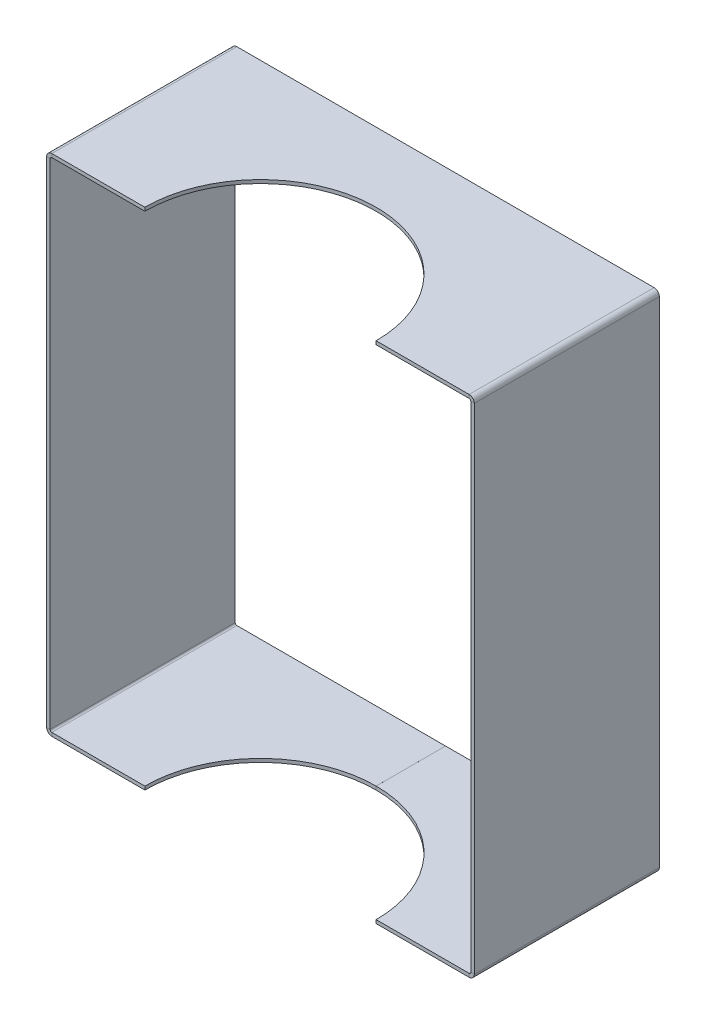
ISO-10303-21;
HEADER;
FILE_DESCRIPTION(('STEP AP214'),'2;1');
FILE_NAME('part.step','',(''),(''),'','','');
FILE_SCHEMA(('AUTOMOTIVE_DESIGN { 1 0 10303 214 1 1 1 1 }'));
ENDSEC;
DATA;
#1=APPLICATION_CONTEXT('core data for automotive mechanical design processes');
#2=APPLICATION_PROTOCOL_DEFINITION('international standard','automotive_design',2000,#1);
#3=PRODUCT_CONTEXT('',#1,'mechanical');
#4=PRODUCT('Part','Part','',(#3));
#5=PRODUCT_RELATED_PRODUCT_CATEGORY('part','',(#4));
#6=PRODUCT_DEFINITION_FORMATION('','',#4);
#7=PRODUCT_DEFINITION_CONTEXT('part definition',#1,'design');
#8=PRODUCT_DEFINITION('design','',#6,#7);
#9=PRODUCT_DEFINITION_SHAPE('','',#8);
#10=(LENGTH_UNIT() NAMED_UNIT(*) SI_UNIT(.MILLI.,.METRE.));
#11=(NAMED_UNIT(*) PLANE_ANGLE_UNIT() SI_UNIT($,.RADIAN.));
#12=(NAMED_UNIT(*) SI_UNIT($,.STERADIAN.) SOLID_ANGLE_UNIT());
#13=UNCERTAINTY_MEASURE_WITH_UNIT(LENGTH_MEASURE(1.E-05),#10,'distance_accuracy_value','');
#14=(GEOMETRIC_REPRESENTATION_CONTEXT(3) GLOBAL_UNCERTAINTY_ASSIGNED_CONTEXT((#13)) GLOBAL_UNIT_ASSIGNED_CONTEXT((#10,
#11,#12)) REPRESENTATION_CONTEXT('',''));
#15=CARTESIAN_POINT('',(0.,0.,0.));
#16=DIRECTION('',(0.,0.,1.));
#17=DIRECTION('',(1.,0.,0.));
#18=AXIS2_PLACEMENT_3D('',#15,#16,#17);
#19=CARTESIAN_POINT('',(-90.2234000000008,1.5,173.673110700389));
#20=DIRECTION('',(0.,0.,-1.));
#21=DIRECTION('',(-1.,0.,0.));
#22=AXIS2_PLACEMENT_3D('',#19,#20,#21);
#23=PLANE('',#22);
#24=DIRECTION('',(1.,0.,0.));
#25=VECTOR('',#24,1.);
#26=CARTESIAN_POINT('',(-90.2234000000008,0.,173.673110700389));
#27=LINE('',#26,#25);
#28=CARTESIAN_POINT('',(-90.2234000000008,0.,173.673110700389));
#29=VERTEX_POINT('',#28);
#30=CARTESIAN_POINT('',(-50.0234000000008,0.,173.673110700389));
#31=VERTEX_POINT('',#30);
#32=EDGE_CURVE('E151',#29,#31,#27,.T.);
#33=ORIENTED_EDGE('',*,*,#32,.T.);
#34=DIRECTION('',(0.,-1.,0.));
#35=VECTOR('',#34,1.);
#36=CARTESIAN_POINT('',(-50.0234000000008,1.5,173.673110700389));
#37=LINE('',#36,#35);
#38=CARTESIAN_POINT('',(-50.0234000000008,1.5,173.673110700389));
#39=VERTEX_POINT('',#38);
#40=EDGE_CURVE('E131',#39,#31,#37,.T.);
#41=ORIENTED_EDGE('',*,*,#40,.F.);
#42=DIRECTION('',(1.,0.,0.));
#43=VECTOR('',#42,1.);
#44=CARTESIAN_POINT('',(-90.2234000000008,1.5,173.673110700389));
#45=LINE('',#44,#43);
#46=CARTESIAN_POINT('',(-90.2234000000008,1.5,173.673110700389));
#47=VERTEX_POINT('',#46);
#48=EDGE_CURVE('E182',#47,#39,#45,.T.);
#49=ORIENTED_EDGE('',*,*,#48,.F.);
#50=DIRECTION('',(0.,-1.,0.));
#51=VECTOR('',#50,1.);
#52=CARTESIAN_POINT('',(-90.2234000000008,1.5,173.673110700389));
#53=LINE('',#52,#51);
#54=EDGE_CURVE('E13',#47,#29,#53,.T.);
#55=ORIENTED_EDGE('',*,*,#54,.T.);
#56=EDGE_LOOP('',(#33,#41,#49,#55));
#57=FACE_BOUND('',#56,.T.);
#58=ADVANCED_FACE('F123',(#57),#23,.F.);
#59=CARTESIAN_POINT('',(-0.0234000000007839,1.5,173.673110700389));
#60=DIRECTION('',(0.,-1.,0.));
#61=DIRECTION('',(0.,0.,-1.));
#62=AXIS2_PLACEMENT_3D('',#59,#60,#61);
#63=CYLINDRICAL_SURFACE('',#62,50.);
#64=CARTESIAN_POINT('',(-0.0234000000007839,0.,173.673110700389));
#65=DIRECTION('',(0.,-1.,0.));
#66=DIRECTION('',(0.,0.,-1.));
#67=AXIS2_PLACEMENT_3D('',#64,#65,#66);
#68=CIRCLE('',#67,50.);
#69=CARTESIAN_POINT('',(49.9765999999992,0.,173.673110700389));
#70=VERTEX_POINT('',#69);
#71=EDGE_CURVE('E211',#31,#70,#68,.T.);
#72=ORIENTED_EDGE('',*,*,#71,.T.);
#73=DIRECTION('',(0.,-1.,0.));
#74=VECTOR('',#73,1.);
#75=CARTESIAN_POINT('',(49.9765999999992,1.5,173.673110700389));
#76=LINE('',#75,#74);
#77=CARTESIAN_POINT('',(49.9765999999992,1.5,173.673110700389));
#78=VERTEX_POINT('',#77);
#79=EDGE_CURVE('E194',#78,#70,#76,.T.);
#80=ORIENTED_EDGE('',*,*,#79,.F.);
#81=CARTESIAN_POINT('',(-0.0234000000007839,1.5,173.673110700389));
#82=DIRECTION('',(0.,-1.,0.));
#83=DIRECTION('',(0.,0.,-1.));
#84=AXIS2_PLACEMENT_3D('',#81,#82,#83);
#85=CIRCLE('',#84,50.);
#86=EDGE_CURVE('E186',#39,#78,#85,.T.);
#87=ORIENTED_EDGE('',*,*,#86,.F.);
#88=ORIENTED_EDGE('',*,*,#40,.T.);
#89=EDGE_LOOP('',(#72,#80,#87,#88));
#90=FACE_BOUND('',#89,.T.);
#91=ADVANCED_FACE('F195',(#90),#63,.F.);
#92=CARTESIAN_POINT('',(49.9765999999992,1.5,173.673110700389));
#93=DIRECTION('',(0.,0.,-1.));
#94=DIRECTION('',(-1.,0.,0.));
#95=AXIS2_PLACEMENT_3D('',#92,#93,#94);
#96=PLANE('',#95);
#97=DIRECTION('',(1.,0.,0.));
#98=VECTOR('',#97,1.);
#99=CARTESIAN_POINT('',(49.9765999999992,0.,173.673110700389));
#100=LINE('',#99,#98);
#101=CARTESIAN_POINT('',(90.1765999999992,0.,173.673110700389));
#102=VERTEX_POINT('',#101);
#103=EDGE_CURVE('E213',#70,#102,#100,.T.);
#104=ORIENTED_EDGE('',*,*,#103,.T.);
#105=DIRECTION('',(0.,-1.,0.));
#106=VECTOR('',#105,1.);
#107=CARTESIAN_POINT('',(90.1765999999992,1.5,173.673110700389));
#108=LINE('',#107,#106);
#109=CARTESIAN_POINT('',(90.1765999999993,1.5,173.673110700389));
#110=VERTEX_POINT('',#109);
#111=EDGE_CURVE('E226',#110,#102,#108,.T.);
#112=ORIENTED_EDGE('',*,*,#111,.F.);
#113=DIRECTION('',(1.,0.,0.));
#114=VECTOR('',#113,1.);
#115=CARTESIAN_POINT('',(49.9765999999992,1.5,173.673110700389));
#116=LINE('',#115,#114);
#117=EDGE_CURVE('E198',#78,#110,#116,.T.);
#118=ORIENTED_EDGE('',*,*,#117,.F.);
#119=ORIENTED_EDGE('',*,*,#79,.T.);
#120=EDGE_LOOP('',(#104,#112,#118,#119));
#121=FACE_BOUND('',#120,.T.);
#122=ADVANCED_FACE('F230',(#121),#96,.F.);
#123=CARTESIAN_POINT('',(-90.2234000000008,1.5,93.673110700389));
#124=DIRECTION('',(0.,0.,1.));
#125=DIRECTION('',(1.,0.,0.));
#126=AXIS2_PLACEMENT_3D('',#123,#124,#125);
#127=PLANE('',#126);
#128=DIRECTION('',(-1.,0.,0.));
#129=VECTOR('',#128,1.);
#130=CARTESIAN_POINT('',(-90.2234000000008,0.,93.673110700389));
#131=LINE('',#130,#129);
#132=CARTESIAN_POINT('',(90.1765999999992,0.,93.673110700389));
#133=VERTEX_POINT('',#132);
#134=CARTESIAN_POINT('',(-90.2234000000008,0.,93.673110700389));
#135=VERTEX_POINT('',#134);
#136=EDGE_CURVE('E218',#133,#135,#131,.T.);
#137=ORIENTED_EDGE('',*,*,#136,.T.);
#138=DIRECTION('',(0.,-1.,0.));
#139=VECTOR('',#138,1.);
#140=CARTESIAN_POINT('',(-90.2234000000008,1.5,93.673110700389));
#141=LINE('',#140,#139);
#142=CARTESIAN_POINT('',(-90.2234000000008,1.49999999999998,93.673110700389));
#143=VERTEX_POINT('',#142);
#144=EDGE_CURVE('E206',#143,#135,#141,.T.);
#145=ORIENTED_EDGE('',*,*,#144,.F.);
#146=DIRECTION('',(-1.,0.,0.));
#147=VECTOR('',#146,1.);
#148=CARTESIAN_POINT('',(-90.2234000000008,1.5,93.673110700389));
#149=LINE('',#148,#147);
#150=CARTESIAN_POINT('',(90.1765999999992,1.5,93.673110700389));
#151=VERTEX_POINT('',#150);
#152=EDGE_CURVE('E204',#151,#143,#149,.T.);
#153=ORIENTED_EDGE('',*,*,#152,.F.);
#154=DIRECTION('',(0.,-1.,0.));
#155=VECTOR('',#154,1.);
#156=CARTESIAN_POINT('',(90.1765999999992,1.5,93.673110700389));
#157=LINE('',#156,#155);
#158=EDGE_CURVE('E223',#151,#133,#157,.T.);
#159=ORIENTED_EDGE('',*,*,#158,.T.);
#160=EDGE_LOOP('',(#137,#145,#153,#159));
#161=FACE_BOUND('',#160,.T.);
#162=ADVANCED_FACE('F254',(#161),#127,.F.);
#163=CARTESIAN_POINT('',(-0.0234000000007839,1.5,173.673110700389));
#164=DIRECTION('',(0.,-1.,0.));
#165=DIRECTION('',(0.,0.,-1.));
#166=AXIS2_PLACEMENT_3D('',#163,#164,#165);
#167=PLANE('',#166);
#168=DIRECTION('',(0.,0.,1.));
#169=VECTOR('',#168,1.);
#170=CARTESIAN_POINT('',(-90.2234000000008,1.5,93.673110700389));
#171=LINE('',#170,#169);
#172=EDGE_CURVE('E190',#143,#47,#171,.T.);
#173=ORIENTED_EDGE('',*,*,#172,.T.);
#174=ORIENTED_EDGE('',*,*,#48,.T.);
#175=ORIENTED_EDGE('',*,*,#86,.T.);
#176=ORIENTED_EDGE('',*,*,#117,.T.);
#177=DIRECTION('',(0.,0.,-1.));
#178=VECTOR('',#177,1.);
#179=CARTESIAN_POINT('',(90.1765999999992,1.5,93.673110700389));
#180=LINE('',#179,#178);
#181=EDGE_CURVE('E159',#110,#151,#180,.T.);
#182=ORIENTED_EDGE('',*,*,#181,.T.);
#183=ORIENTED_EDGE('',*,*,#152,.T.);
#184=EDGE_LOOP('',(#173,#174,#175,#176,#182,#183));
#185=FACE_BOUND('',#184,.T.);
#186=ADVANCED_FACE('F183',(#185),#167,.F.);
#187=CARTESIAN_POINT('',(-0.0234000000007839,0.,173.673110700389));
#188=DIRECTION('',(0.,-1.,0.));
#189=DIRECTION('',(0.,0.,-1.));
#190=AXIS2_PLACEMENT_3D('',#187,#188,#189);
#191=PLANE('',#190);
#192=DIRECTION('',(0.,0.,1.));
#193=VECTOR('',#192,1.);
#194=CARTESIAN_POINT('',(-90.2234000000008,0.,93.673110700389));
#195=LINE('',#194,#193);
#196=EDGE_CURVE('E207',#135,#29,#195,.T.);
#197=ORIENTED_EDGE('',*,*,#196,.F.);
#198=ORIENTED_EDGE('',*,*,#136,.F.);
#199=DIRECTION('',(0.,0.,-1.));
#200=VECTOR('',#199,1.);
#201=CARTESIAN_POINT('',(90.1765999999992,0.,93.673110700389));
#202=LINE('',#201,#200);
#203=EDGE_CURVE('E216',#102,#133,#202,.T.);
#204=ORIENTED_EDGE('',*,*,#203,.F.);
#205=ORIENTED_EDGE('',*,*,#103,.F.);
#206=ORIENTED_EDGE('',*,*,#71,.F.);
#207=ORIENTED_EDGE('',*,*,#32,.F.);
#208=EDGE_LOOP('',(#197,#198,#204,#205,#206,#207));
#209=FACE_BOUND('',#208,.T.);
#210=ADVANCED_FACE('F235',(#209),#191,.T.);
#211=CARTESIAN_POINT('',(90.1765999999992,-0.736600000000006,93.673110700389));
#212=DIRECTION('',(0.,0.,-1.));
#213=DIRECTION('',(-1.,0.,0.));
#214=AXIS2_PLACEMENT_3D('',#211,#212,#213);
#215=PLANE('',#214);
#216=DIRECTION('',(1.,0.,0.));
#217=VECTOR('',#216,1.);
#218=CARTESIAN_POINT('',(92.4131999999992,-0.736600000000004,93.673110700389));
#219=LINE('',#218,#217);
#220=CARTESIAN_POINT('',(90.9131999999992,-0.736600000000004,93.673110700389));
#221=VERTEX_POINT('',#220);
#222=CARTESIAN_POINT('',(92.4131999999992,-0.736599999999999,93.673110700389));
#223=VERTEX_POINT('',#222);
#224=EDGE_CURVE('E249',#221,#223,#219,.T.);
#225=ORIENTED_EDGE('',*,*,#224,.F.);
#226=CARTESIAN_POINT('',(90.1765999999992,-0.736600000000006,93.673110700389));
#227=DIRECTION('',(0.,0.,1.));
#228=DIRECTION('',(1.,0.,0.));
#229=AXIS2_PLACEMENT_3D('',#226,#227,#228);
#230=CIRCLE('',#229,0.736600000000004);
#231=EDGE_CURVE('E242',#133,#221,#230,.F.);
#232=ORIENTED_EDGE('',*,*,#231,.F.);
#233=ORIENTED_EDGE('',*,*,#158,.F.);
#234=CARTESIAN_POINT('',(90.1765999999992,-0.736600000000006,93.673110700389));
#235=DIRECTION('',(0.,0.,1.));
#236=DIRECTION('',(1.,0.,0.));
#237=AXIS2_PLACEMENT_3D('',#234,#235,#236);
#238=CIRCLE('',#237,2.2366);
#239=EDGE_CURVE('E139',#151,#223,#238,.F.);
#240=ORIENTED_EDGE('',*,*,#239,.T.);
#241=EDGE_LOOP('',(#225,#232,#233,#240));
#242=FACE_BOUND('',#241,.T.);
#243=ADVANCED_FACE('F247',(#242),#215,.T.);
#244=CARTESIAN_POINT('',(90.1765999999992,-0.736600000000006,173.673110700389));
#245=DIRECTION('',(0.,0.,-1.));
#246=DIRECTION('',(-1.,0.,0.));
#247=AXIS2_PLACEMENT_3D('',#244,#245,#246);
#248=PLANE('',#247);
#249=CARTESIAN_POINT('',(90.1765999999992,-0.736600000000006,173.673110700389));
#250=DIRECTION('',(0.,0.,1.));
#251=DIRECTION('',(1.,0.,0.));
#252=AXIS2_PLACEMENT_3D('',#249,#250,#251);
#253=CIRCLE('',#252,0.736600000000004);
#254=CARTESIAN_POINT('',(90.9131999999992,-0.736600000000004,173.673110700389));
#255=VERTEX_POINT('',#254);
#256=EDGE_CURVE('E245',#255,#102,#253,.T.);
#257=ORIENTED_EDGE('',*,*,#256,.F.);
#258=DIRECTION('',(1.,0.,0.));
#259=VECTOR('',#258,1.);
#260=CARTESIAN_POINT('',(90.9131999999993,-0.736600000000004,173.673110700389));
#261=LINE('',#260,#259);
#262=CARTESIAN_POINT('',(92.4131999999992,-0.736599999999999,173.673110700389));
#263=VERTEX_POINT('',#262);
#264=EDGE_CURVE('E377',#255,#263,#261,.T.);
#265=ORIENTED_EDGE('',*,*,#264,.T.);
#266=CARTESIAN_POINT('',(90.1765999999992,-0.736600000000006,173.673110700389));
#267=DIRECTION('',(0.,0.,1.));
#268=DIRECTION('',(1.,0.,0.));
#269=AXIS2_PLACEMENT_3D('',#266,#267,#268);
#270=CIRCLE('',#269,2.2366);
#271=EDGE_CURVE('E250',#263,#110,#270,.T.);
#272=ORIENTED_EDGE('',*,*,#271,.T.);
#273=ORIENTED_EDGE('',*,*,#111,.T.);
#274=EDGE_LOOP('',(#257,#265,#272,#273));
#275=FACE_BOUND('',#274,.T.);
#276=ADVANCED_FACE('F385',(#275),#248,.F.);
#277=CARTESIAN_POINT('',(90.1765999999992,-0.736600000000006,173.673110700389));
#278=DIRECTION('',(0.,0.,1.));
#279=DIRECTION('',(1.,0.,0.));
#280=AXIS2_PLACEMENT_3D('',#277,#278,#279);
#281=CYLINDRICAL_SURFACE('',#280,2.2366);
#282=ORIENTED_EDGE('',*,*,#181,.F.);
#283=ORIENTED_EDGE('',*,*,#271,.F.);
#284=DIRECTION('',(0.,0.,1.));
#285=VECTOR('',#284,1.);
#286=CARTESIAN_POINT('',(92.4131999999992,-0.736599999999999,173.673110700389));
#287=LINE('',#286,#285);
#288=EDGE_CURVE('E329',#223,#263,#287,.T.);
#289=ORIENTED_EDGE('',*,*,#288,.F.);
#290=ORIENTED_EDGE('',*,*,#239,.F.);
#291=EDGE_LOOP('',(#282,#283,#289,#290));
#292=FACE_BOUND('',#291,.T.);
#293=ADVANCED_FACE('F387',(#292),#281,.T.);
#294=CARTESIAN_POINT('',(90.1765999999992,-0.736600000000006,173.673110700389));
#295=DIRECTION('',(0.,0.,1.));
#296=DIRECTION('',(1.,0.,0.));
#297=AXIS2_PLACEMENT_3D('',#294,#295,#296);
#298=CYLINDRICAL_SURFACE('',#297,0.736600000000004);
#299=ORIENTED_EDGE('',*,*,#203,.T.);
#300=ORIENTED_EDGE('',*,*,#231,.T.);
#301=DIRECTION('',(0.,0.,-1.));
#302=VECTOR('',#301,1.);
#303=CARTESIAN_POINT('',(90.9131999999992,-0.736600000000004,93.673110700389));
#304=LINE('',#303,#302);
#305=EDGE_CURVE('E327',#221,#255,#304,.F.);
#306=ORIENTED_EDGE('',*,*,#305,.T.);
#307=ORIENTED_EDGE('',*,*,#256,.T.);
#308=EDGE_LOOP('',(#299,#300,#306,#307));
#309=FACE_BOUND('',#308,.T.);
#310=ADVANCED_FACE('F241',(#309),#298,.F.);
#311=CARTESIAN_POINT('',(92.4131999999992,0.,173.673110700389));
#312=DIRECTION('',(0.,0.,1.));
#313=DIRECTION('',(1.,0.,0.));
#314=AXIS2_PLACEMENT_3D('',#311,#312,#313);
#315=PLANE('',#314);
#316=DIRECTION('',(0.,1.,0.));
#317=VECTOR('',#316,1.);
#318=CARTESIAN_POINT('',(92.4131999999992,0.,173.673110700389));
#319=LINE('',#318,#317);
#320=CARTESIAN_POINT('',(92.4132,-214.5,173.673110700389));
#321=VERTEX_POINT('',#320);
#322=EDGE_CURVE('E342',#321,#263,#319,.T.);
#323=ORIENTED_EDGE('',*,*,#322,.T.);
#324=ORIENTED_EDGE('',*,*,#264,.F.);
#325=DIRECTION('',(0.,-1.,0.));
#326=VECTOR('',#325,1.);
#327=CARTESIAN_POINT('',(90.9131999999992,0.,173.673110700389));
#328=LINE('',#327,#326);
#329=CARTESIAN_POINT('',(90.9132,-214.5,173.673110700389));
#330=VERTEX_POINT('',#329);
#331=EDGE_CURVE('E352',#330,#255,#328,.F.);
#332=ORIENTED_EDGE('',*,*,#331,.F.);
#333=DIRECTION('',(-1.,0.,0.));
#334=VECTOR('',#333,1.);
#335=CARTESIAN_POINT('',(92.4132,-214.5,173.673110700389));
#336=LINE('',#335,#334);
#337=EDGE_CURVE('E341',#321,#330,#336,.T.);
#338=ORIENTED_EDGE('',*,*,#337,.F.);
#339=EDGE_LOOP('',(#323,#324,#332,#338));
#340=FACE_BOUND('',#339,.T.);
#341=ADVANCED_FACE('F660',(#340),#315,.T.);
#342=CARTESIAN_POINT('',(92.4132,-214.5,93.673110700389));
#343=DIRECTION('',(0.,0.,-1.));
#344=DIRECTION('',(-1.,0.,0.));
#345=AXIS2_PLACEMENT_3D('',#342,#343,#344);
#346=PLANE('',#345);
#347=DIRECTION('',(0.,1.,0.));
#348=VECTOR('',#347,1.);
#349=CARTESIAN_POINT('',(90.9131999999992,0.,93.673110700389));
#350=LINE('',#349,#348);
#351=CARTESIAN_POINT('',(90.9132,-214.5,93.673110700389));
#352=VERTEX_POINT('',#351);
#353=EDGE_CURVE('E320',#221,#352,#350,.F.);
#354=ORIENTED_EDGE('',*,*,#353,.F.);
#355=ORIENTED_EDGE('',*,*,#224,.T.);
#356=DIRECTION('',(0.,-1.,0.));
#357=VECTOR('',#356,1.);
#358=CARTESIAN_POINT('',(92.4132,-214.5,93.673110700389));
#359=LINE('',#358,#357);
#360=CARTESIAN_POINT('',(92.4132,-214.5,93.673110700389));
#361=VERTEX_POINT('',#360);
#362=EDGE_CURVE('E335',#223,#361,#359,.T.);
#363=ORIENTED_EDGE('',*,*,#362,.T.);
#364=DIRECTION('',(-1.,0.,0.));
#365=VECTOR('',#364,1.);
#366=CARTESIAN_POINT('',(92.4132,-214.5,93.673110700389));
#367=LINE('',#366,#365);
#368=EDGE_CURVE('E332',#361,#352,#367,.T.);
#369=ORIENTED_EDGE('',*,*,#368,.T.);
#370=EDGE_LOOP('',(#354,#355,#363,#369));
#371=FACE_BOUND('',#370,.T.);
#372=ADVANCED_FACE('F333',(#371),#346,.T.);
#373=CARTESIAN_POINT('',(92.4131999999992,0.,173.673110700389));
#374=DIRECTION('',(1.,0.,0.));
#375=DIRECTION('',(0.,1.,0.));
#376=AXIS2_PLACEMENT_3D('',#373,#374,#375);
#377=PLANE('',#376);
#378=ORIENTED_EDGE('',*,*,#362,.F.);
#379=ORIENTED_EDGE('',*,*,#288,.T.);
#380=ORIENTED_EDGE('',*,*,#322,.F.);
#381=DIRECTION('',(0.,0.,1.));
#382=VECTOR('',#381,1.);
#383=CARTESIAN_POINT('',(92.4132,-214.5,173.673110700389));
#384=LINE('',#383,#382);
#385=EDGE_CURVE('E370',#361,#321,#384,.T.);
#386=ORIENTED_EDGE('',*,*,#385,.F.);
#387=EDGE_LOOP('',(#378,#379,#380,#386));
#388=FACE_BOUND('',#387,.T.);
#389=ADVANCED_FACE('F389',(#388),#377,.T.);
#390=CARTESIAN_POINT('',(90.9131999999992,0.,173.673110700389));
#391=DIRECTION('',(1.,0.,0.));
#392=DIRECTION('',(0.,1.,0.));
#393=AXIS2_PLACEMENT_3D('',#390,#391,#392);
#394=PLANE('',#393);
#395=ORIENTED_EDGE('',*,*,#305,.F.);
#396=ORIENTED_EDGE('',*,*,#353,.T.);
#397=DIRECTION('',(0.,0.,-1.));
#398=VECTOR('',#397,1.);
#399=CARTESIAN_POINT('',(90.9132,-214.5,173.673110700389));
#400=LINE('',#399,#398);
#401=EDGE_CURVE('E325',#352,#330,#400,.F.);
#402=ORIENTED_EDGE('',*,*,#401,.T.);
#403=ORIENTED_EDGE('',*,*,#331,.T.);
#404=EDGE_LOOP('',(#395,#396,#402,#403));
#405=FACE_BOUND('',#404,.T.);
#406=ADVANCED_FACE('F322',(#405),#394,.F.);
#407=CARTESIAN_POINT('',(90.1766,-214.5,93.673110700389));
#408=DIRECTION('',(0.,0.,-1.));
#409=DIRECTION('',(-1.,0.,0.));
#410=AXIS2_PLACEMENT_3D('',#407,#408,#409);
#411=PLANE('',#410);
#412=DIRECTION('',(0.,-1.,0.));
#413=VECTOR('',#412,1.);
#414=CARTESIAN_POINT('',(90.1766,-216.7366,93.673110700389));
#415=LINE('',#414,#413);
#416=CARTESIAN_POINT('',(90.1766,-215.2366,93.673110700389));
#417=VERTEX_POINT('',#416);
#418=CARTESIAN_POINT('',(90.1766,-216.7366,93.673110700389));
#419=VERTEX_POINT('',#418);
#420=EDGE_CURVE('E356',#417,#419,#415,.T.);
#421=ORIENTED_EDGE('',*,*,#420,.F.);
#422=CARTESIAN_POINT('',(90.1766,-214.5,93.673110700389));
#423=DIRECTION('',(0.,0.,1.));
#424=DIRECTION('',(1.,0.,0.));
#425=AXIS2_PLACEMENT_3D('',#422,#423,#424);
#426=CIRCLE('',#425,0.736600000000004);
#427=EDGE_CURVE('E348',#352,#417,#426,.F.);
#428=ORIENTED_EDGE('',*,*,#427,.F.);
#429=ORIENTED_EDGE('',*,*,#368,.F.);
#430=CARTESIAN_POINT('',(90.1766,-214.5,93.673110700389));
#431=DIRECTION('',(0.,0.,1.));
#432=DIRECTION('',(1.,0.,0.));
#433=AXIS2_PLACEMENT_3D('',#430,#431,#432);
#434=CIRCLE('',#433,2.2366);
#435=EDGE_CURVE('E360',#361,#419,#434,.F.);
#436=ORIENTED_EDGE('',*,*,#435,.T.);
#437=EDGE_LOOP('',(#421,#428,#429,#436));
#438=FACE_BOUND('',#437,.T.);
#439=ADVANCED_FACE('F354',(#438),#411,.T.);
#440=CARTESIAN_POINT('',(90.1766,-214.5,173.673110700389));
#441=DIRECTION('',(0.,0.,-1.));
#442=DIRECTION('',(-1.,0.,0.));
#443=AXIS2_PLACEMENT_3D('',#440,#441,#442);
#444=PLANE('',#443);
#445=CARTESIAN_POINT('',(90.1766,-214.5,173.673110700389));
#446=DIRECTION('',(0.,0.,1.));
#447=DIRECTION('',(1.,0.,0.));
#448=AXIS2_PLACEMENT_3D('',#445,#446,#447);
#449=CIRCLE('',#448,0.736600000000004);
#450=CARTESIAN_POINT('',(90.1766,-215.2366,173.673110700389));
#451=VERTEX_POINT('',#450);
#452=EDGE_CURVE('E351',#451,#330,#449,.T.);
#453=ORIENTED_EDGE('',*,*,#452,.F.);
#454=DIRECTION('',(0.,-1.,0.));
#455=VECTOR('',#454,1.);
#456=CARTESIAN_POINT('',(90.1766,-215.2366,173.673110700389));
#457=LINE('',#456,#455);
#458=CARTESIAN_POINT('',(90.1766,-216.7366,173.673110700389));
#459=VERTEX_POINT('',#458);
#460=EDGE_CURVE('E397',#451,#459,#457,.T.);
#461=ORIENTED_EDGE('',*,*,#460,.T.);
#462=CARTESIAN_POINT('',(90.1766,-214.5,173.673110700389));
#463=DIRECTION('',(0.,0.,1.));
#464=DIRECTION('',(1.,0.,0.));
#465=AXIS2_PLACEMENT_3D('',#462,#463,#464);
#466=CIRCLE('',#465,2.2366);
#467=EDGE_CURVE('E357',#459,#321,#466,.T.);
#468=ORIENTED_EDGE('',*,*,#467,.T.);
#469=ORIENTED_EDGE('',*,*,#337,.T.);
#470=EDGE_LOOP('',(#453,#461,#468,#469));
#471=FACE_BOUND('',#470,.T.);
#472=ADVANCED_FACE('F395',(#471),#444,.F.);
#473=CARTESIAN_POINT('',(90.1766,-214.5,173.673110700389));
#474=DIRECTION('',(0.,0.,1.));
#475=DIRECTION('',(0.,-1.,0.));
#476=AXIS2_PLACEMENT_3D('',#473,#474,#475);
#477=CYLINDRICAL_SURFACE('',#476,2.2366);
#478=ORIENTED_EDGE('',*,*,#385,.T.);
#479=ORIENTED_EDGE('',*,*,#467,.F.);
#480=DIRECTION('',(0.,0.,1.));
#481=VECTOR('',#480,1.);
#482=CARTESIAN_POINT('',(90.1766,-216.7366,93.673110700389));
#483=LINE('',#482,#481);
#484=EDGE_CURVE('E403',#459,#419,#483,.F.);
#485=ORIENTED_EDGE('',*,*,#484,.T.);
#486=ORIENTED_EDGE('',*,*,#435,.F.);
#487=EDGE_LOOP('',(#478,#479,#485,#486));
#488=FACE_BOUND('',#487,.T.);
#489=ADVANCED_FACE('F392',(#488),#477,.T.);
#490=CARTESIAN_POINT('',(90.1766,-214.5,173.673110700389));
#491=DIRECTION('',(0.,0.,1.));
#492=DIRECTION('',(0.,-1.,0.));
#493=AXIS2_PLACEMENT_3D('',#490,#491,#492);
#494=CYLINDRICAL_SURFACE('',#493,0.736600000000004);
#495=ORIENTED_EDGE('',*,*,#401,.F.);
#496=ORIENTED_EDGE('',*,*,#427,.T.);
#497=DIRECTION('',(0.,0.,1.));
#498=VECTOR('',#497,1.);
#499=CARTESIAN_POINT('',(90.1766,-215.2366,93.673110700389));
#500=LINE('',#499,#498);
#501=EDGE_CURVE('E404',#417,#451,#500,.T.);
#502=ORIENTED_EDGE('',*,*,#501,.T.);
#503=ORIENTED_EDGE('',*,*,#452,.T.);
#504=EDGE_LOOP('',(#495,#496,#502,#503));
#505=FACE_BOUND('',#504,.T.);
#506=ADVANCED_FACE('F347',(#505),#494,.F.);
#507=CARTESIAN_POINT('',(49.9766000000007,-216.7366,173.673110700388));
#508=DIRECTION('',(0.,0.,1.));
#509=DIRECTION('',(1.,0.,0.));
#510=AXIS2_PLACEMENT_3D('',#507,#508,#509);
#511=PLANE('',#510);
#512=DIRECTION('',(-1.,0.,0.));
#513=VECTOR('',#512,1.);
#514=CARTESIAN_POINT('',(49.9766000000007,-216.7366,173.673110700388));
#515=LINE('',#514,#513);
#516=CARTESIAN_POINT('',(49.9766000000007,-216.7366,173.673110700388));
#517=VERTEX_POINT('',#516);
#518=EDGE_CURVE('E411',#517,#459,#515,.F.);
#519=ORIENTED_EDGE('',*,*,#518,.T.);
#520=ORIENTED_EDGE('',*,*,#460,.F.);
#521=DIRECTION('',(1.,0.,0.));
#522=VECTOR('',#521,1.);
#523=CARTESIAN_POINT('',(-0.0218000000000137,-215.236600000001,173.673110700388));
#524=LINE('',#523,#522);
#525=CARTESIAN_POINT('',(49.9766000000007,-215.2366,173.673110700388));
#526=VERTEX_POINT('',#525);
#527=EDGE_CURVE('E431',#526,#451,#524,.T.);
#528=ORIENTED_EDGE('',*,*,#527,.F.);
#529=DIRECTION('',(0.,1.,0.));
#530=VECTOR('',#529,1.);
#531=CARTESIAN_POINT('',(49.9766000000007,-216.7366,173.673110700388));
#532=LINE('',#531,#530);
#533=EDGE_CURVE('E362',#517,#526,#532,.T.);
#534=ORIENTED_EDGE('',*,*,#533,.F.);
#535=EDGE_LOOP('',(#519,#520,#528,#534));
#536=FACE_BOUND('',#535,.T.);
#537=ADVANCED_FACE('F416',(#536),#511,.T.);
#538=CARTESIAN_POINT('',(-0.0218000000000171,-216.736600000001,93.673110700389));
#539=DIRECTION('',(0.,0.,-1.));
#540=DIRECTION('',(-1.,0.,0.));
#541=AXIS2_PLACEMENT_3D('',#538,#539,#540);
#542=PLANE('',#541);
#543=DIRECTION('',(-1.,0.,0.));
#544=VECTOR('',#543,1.);
#545=CARTESIAN_POINT('',(-0.0218000000000259,-215.236600000001,93.673110700389));
#546=LINE('',#545,#544);
#547=CARTESIAN_POINT('',(-0.0218000000000276,-215.236600000001,93.673110700389));
#548=VERTEX_POINT('',#547);
#549=EDGE_CURVE('E414',#417,#548,#546,.T.);
#550=ORIENTED_EDGE('',*,*,#549,.F.);
#551=ORIENTED_EDGE('',*,*,#420,.T.);
#552=DIRECTION('',(1.,0.,0.));
#553=VECTOR('',#552,1.);
#554=CARTESIAN_POINT('',(-0.0218000000000171,-216.736600000001,93.673110700389));
#555=LINE('',#554,#553);
#556=CARTESIAN_POINT('',(-0.0218000000000171,-216.736600000001,93.673110700389));
#557=VERTEX_POINT('',#556);
#558=EDGE_CURVE('E413',#419,#557,#555,.F.);
#559=ORIENTED_EDGE('',*,*,#558,.T.);
#560=DIRECTION('',(0.,1.,0.));
#561=VECTOR('',#560,1.);
#562=CARTESIAN_POINT('',(-0.0218000000000171,-216.736600000001,93.673110700389));
#563=LINE('',#562,#561);
#564=EDGE_CURVE('E418',#557,#548,#563,.T.);
#565=ORIENTED_EDGE('',*,*,#564,.T.);
#566=EDGE_LOOP('',(#550,#551,#559,#565));
#567=FACE_BOUND('',#566,.T.);
#568=ADVANCED_FACE('F444',(#567),#542,.T.);
#569=CARTESIAN_POINT('',(-0.0218000000000032,-216.736600000001,173.673110700389));
#570=DIRECTION('',(0.,1.,0.));
#571=DIRECTION('',(-1.,0.,0.));
#572=AXIS2_PLACEMENT_3D('',#569,#570,#571);
#573=PLANE('',#572);
#574=ORIENTED_EDGE('',*,*,#484,.F.);
#575=ORIENTED_EDGE('',*,*,#518,.F.);
#576=CARTESIAN_POINT('',(-0.0218000000000032,-216.736600000001,173.673110700389));
#577=DIRECTION('',(0.,1.,0.));
#578=DIRECTION('',(-1.,0.,0.));
#579=AXIS2_PLACEMENT_3D('',#576,#577,#578);
#580=CIRCLE('',#579,49.9984000000007);
#581=CARTESIAN_POINT('',(-0.0218000000000032,-216.736600000001,123.674710700388));
#582=VERTEX_POINT('',#581);
#583=EDGE_CURVE('E419',#582,#517,#580,.F.);
#584=ORIENTED_EDGE('',*,*,#583,.F.);
#585=DIRECTION('',(0.,0.,-1.));
#586=VECTOR('',#585,1.);
#587=CARTESIAN_POINT('',(-0.0218000000000032,-216.736600000001,123.674710700388));
#588=LINE('',#587,#586);
#589=EDGE_CURVE('E424',#557,#582,#588,.F.);
#590=ORIENTED_EDGE('',*,*,#589,.F.);
#591=ORIENTED_EDGE('',*,*,#558,.F.);
#592=EDGE_LOOP('',(#574,#575,#584,#590,#591));
#593=FACE_BOUND('',#592,.T.);
#594=ADVANCED_FACE('F409',(#593),#573,.F.);
#595=CARTESIAN_POINT('',(-0.0218000000000137,-215.236600000001,173.673110700389));
#596=DIRECTION('',(0.,1.,0.));
#597=DIRECTION('',(-1.,0.,0.));
#598=AXIS2_PLACEMENT_3D('',#595,#596,#597);
#599=PLANE('',#598);
#600=ORIENTED_EDGE('',*,*,#527,.T.);
#601=ORIENTED_EDGE('',*,*,#501,.F.);
#602=ORIENTED_EDGE('',*,*,#549,.T.);
#603=DIRECTION('',(0.,0.,1.));
#604=VECTOR('',#603,1.);
#605=CARTESIAN_POINT('',(-0.0217999999999905,-215.236600000001,173.673110700389));
#606=LINE('',#605,#604);
#607=CARTESIAN_POINT('',(-0.0218000000000137,-215.236600000001,123.674710700388));
#608=VERTEX_POINT('',#607);
#609=EDGE_CURVE('E436',#548,#608,#606,.T.);
#610=ORIENTED_EDGE('',*,*,#609,.T.);
#611=CARTESIAN_POINT('',(-0.0218000000000137,-215.236600000001,173.673110700389));
#612=DIRECTION('',(0.,1.,0.));
#613=DIRECTION('',(-1.,0.,0.));
#614=AXIS2_PLACEMENT_3D('',#611,#612,#613);
#615=CIRCLE('',#614,49.9984000000007);
#616=EDGE_CURVE('E433',#608,#526,#615,.F.);
#617=ORIENTED_EDGE('',*,*,#616,.T.);
#618=EDGE_LOOP('',(#600,#601,#602,#610,#617));
#619=FACE_BOUND('',#618,.T.);
#620=ADVANCED_FACE('F448',(#619),#599,.T.);
#621=CARTESIAN_POINT('',(-0.0218000000000032,-216.736600000001,173.673110700389));
#622=DIRECTION('',(0.,1.,0.));
#623=DIRECTION('',(-1.,0.,0.));
#624=AXIS2_PLACEMENT_3D('',#621,#622,#623);
#625=CYLINDRICAL_SURFACE('',#624,49.9984000000007);
#626=ORIENTED_EDGE('',*,*,#616,.F.);
#627=DIRECTION('',(0.,1.,0.));
#628=VECTOR('',#627,1.);
#629=CARTESIAN_POINT('',(-0.0218000000000032,-216.736600000001,123.674710700388));
#630=LINE('',#629,#628);
#631=EDGE_CURVE('E422',#582,#608,#630,.T.);
#632=ORIENTED_EDGE('',*,*,#631,.F.);
#633=ORIENTED_EDGE('',*,*,#583,.T.);
#634=ORIENTED_EDGE('',*,*,#533,.T.);
#635=EDGE_LOOP('',(#626,#632,#633,#634));
#636=FACE_BOUND('',#635,.T.);
#637=ADVANCED_FACE('F451',(#636),#625,.F.);
#638=CARTESIAN_POINT('',(-0.0218000000000032,-216.736600000001,123.674710700388));
#639=DIRECTION('',(-1.,0.,0.));
#640=DIRECTION('',(0.,-1.,0.));
#641=AXIS2_PLACEMENT_3D('',#638,#639,#640);
#642=PLANE('',#641);
#643=ORIENTED_EDGE('',*,*,#609,.F.);
#644=ORIENTED_EDGE('',*,*,#564,.F.);
#645=ORIENTED_EDGE('',*,*,#589,.T.);
#646=ORIENTED_EDGE('',*,*,#631,.T.);
#647=EDGE_LOOP('',(#643,#644,#645,#646));
#648=FACE_BOUND('',#647,.T.);
#649=ADVANCED_FACE('F682',(#648),#642,.T.);
#650=CARTESIAN_POINT('',(-90.2234000000008,-0.736600000000006,173.673110700389));
#651=DIRECTION('',(0.,0.,1.));
#652=DIRECTION('',(1.,0.,0.));
#653=AXIS2_PLACEMENT_3D('',#650,#651,#652);
#654=PLANE('',#653);
#655=DIRECTION('',(-1.,0.,0.));
#656=VECTOR('',#655,1.);
#657=CARTESIAN_POINT('',(-92.4600000000008,-0.736600000000004,173.673110700389));
#658=LINE('',#657,#656);
#659=CARTESIAN_POINT('',(-90.9600000000008,-0.736600000000004,173.673110700389));
#660=VERTEX_POINT('',#659);
#661=CARTESIAN_POINT('',(-92.4600000000008,-0.736599999999999,173.673110700389));
#662=VERTEX_POINT('',#661);
#663=EDGE_CURVE('E465',#660,#662,#658,.T.);
#664=ORIENTED_EDGE('',*,*,#663,.F.);
#665=CARTESIAN_POINT('',(-90.2234000000008,-0.736600000000006,173.673110700389));
#666=DIRECTION('',(0.,0.,-1.));
#667=DIRECTION('',(-1.,0.,0.));
#668=AXIS2_PLACEMENT_3D('',#665,#666,#667);
#669=CIRCLE('',#668,0.73659999999999);
#670=EDGE_CURVE('E457',#29,#660,#669,.F.);
#671=ORIENTED_EDGE('',*,*,#670,.F.);
#672=ORIENTED_EDGE('',*,*,#54,.F.);
#673=CARTESIAN_POINT('',(-90.2234000000008,-0.736600000000006,173.673110700389));
#674=DIRECTION('',(0.,0.,-1.));
#675=DIRECTION('',(-1.,0.,0.));
#676=AXIS2_PLACEMENT_3D('',#673,#674,#675);
#677=CIRCLE('',#676,2.23659999999999);
#678=EDGE_CURVE('E441',#47,#662,#677,.F.);
#679=ORIENTED_EDGE('',*,*,#678,.T.);
#680=EDGE_LOOP('',(#664,#671,#672,#679));
#681=FACE_BOUND('',#680,.T.);
#682=ADVANCED_FACE('F685',(#681),#654,.T.);
#683=CARTESIAN_POINT('',(-90.2234000000008,-0.736600000000006,93.673110700389));
#684=DIRECTION('',(0.,0.,1.));
#685=DIRECTION('',(1.,0.,0.));
#686=AXIS2_PLACEMENT_3D('',#683,#684,#685);
#687=PLANE('',#686);
#688=CARTESIAN_POINT('',(-90.2234000000008,-0.736600000000006,93.673110700389));
#689=DIRECTION('',(0.,0.,-1.));
#690=DIRECTION('',(-1.,0.,0.));
#691=AXIS2_PLACEMENT_3D('',#688,#689,#690);
#692=CIRCLE('',#691,0.73659999999999);
#693=CARTESIAN_POINT('',(-90.9600000000008,-0.736600000000004,93.673110700389));
#694=VERTEX_POINT('',#693);
#695=EDGE_CURVE('E454',#694,#135,#692,.T.);
#696=ORIENTED_EDGE('',*,*,#695,.F.);
#697=DIRECTION('',(-1.,0.,0.));
#698=VECTOR('',#697,1.);
#699=CARTESIAN_POINT('',(-90.9600000000008,-0.736600000000004,93.673110700389));
#700=LINE('',#699,#698);
#701=CARTESIAN_POINT('',(-92.4600000000008,-0.736599999999999,93.673110700389));
#702=VERTEX_POINT('',#701);
#703=EDGE_CURVE('E471',#694,#702,#700,.T.);
#704=ORIENTED_EDGE('',*,*,#703,.T.);
#705=CARTESIAN_POINT('',(-90.2234000000008,-0.736600000000006,93.673110700389));
#706=DIRECTION('',(0.,0.,-1.));
#707=DIRECTION('',(-1.,0.,0.));
#708=AXIS2_PLACEMENT_3D('',#705,#706,#707);
#709=CIRCLE('',#708,2.23659999999999);
#710=EDGE_CURVE('E461',#702,#143,#709,.T.);
#711=ORIENTED_EDGE('',*,*,#710,.T.);
#712=ORIENTED_EDGE('',*,*,#144,.T.);
#713=EDGE_LOOP('',(#696,#704,#711,#712));
#714=FACE_BOUND('',#713,.T.);
#715=ADVANCED_FACE('F695',(#714),#687,.F.);
#716=CARTESIAN_POINT('',(-90.2234000000008,-0.736600000000006,93.673110700389));
#717=DIRECTION('',(0.,0.,-1.));
#718=DIRECTION('',(-1.,0.,0.));
#719=AXIS2_PLACEMENT_3D('',#716,#717,#718);
#720=CYLINDRICAL_SURFACE('',#719,2.23659999999999);
#721=ORIENTED_EDGE('',*,*,#172,.F.);
#722=ORIENTED_EDGE('',*,*,#710,.F.);
#723=DIRECTION('',(0.,0.,-1.));
#724=VECTOR('',#723,1.);
#725=CARTESIAN_POINT('',(-92.4600000000008,-0.736599999999999,93.673110700389));
#726=LINE('',#725,#724);
#727=EDGE_CURVE('E474',#662,#702,#726,.T.);
#728=ORIENTED_EDGE('',*,*,#727,.F.);
#729=ORIENTED_EDGE('',*,*,#678,.F.);
#730=EDGE_LOOP('',(#721,#722,#728,#729));
#731=FACE_BOUND('',#730,.T.);
#732=ADVANCED_FACE('F698',(#731),#720,.T.);
#733=CARTESIAN_POINT('',(-90.2234000000008,-0.736600000000006,93.673110700389));
#734=DIRECTION('',(0.,0.,-1.));
#735=DIRECTION('',(-1.,0.,0.));
#736=AXIS2_PLACEMENT_3D('',#733,#734,#735);
#737=CYLINDRICAL_SURFACE('',#736,0.73659999999999);
#738=ORIENTED_EDGE('',*,*,#196,.T.);
#739=ORIENTED_EDGE('',*,*,#670,.T.);
#740=DIRECTION('',(0.,0.,1.));
#741=VECTOR('',#740,1.);
#742=CARTESIAN_POINT('',(-90.9600000000008,-0.736600000000004,173.673110700389));
#743=LINE('',#742,#741);
#744=EDGE_CURVE('E468',#660,#694,#743,.F.);
#745=ORIENTED_EDGE('',*,*,#744,.T.);
#746=ORIENTED_EDGE('',*,*,#695,.T.);
#747=EDGE_LOOP('',(#738,#739,#745,#746));
#748=FACE_BOUND('',#747,.T.);
#749=ADVANCED_FACE('F700',(#748),#737,.F.);
#750=CARTESIAN_POINT('',(-92.4600000000008,0.,93.673110700389));
#751=DIRECTION('',(0.,0.,-1.));
#752=DIRECTION('',(-1.,0.,0.));
#753=AXIS2_PLACEMENT_3D('',#750,#751,#752);
#754=PLANE('',#753);
#755=DIRECTION('',(0.,1.,0.));
#756=VECTOR('',#755,1.);
#757=CARTESIAN_POINT('',(-92.4600000000008,0.,93.673110700389));
#758=LINE('',#757,#756);
#759=CARTESIAN_POINT('',(-92.4600000000015,-214.5,93.673110700389));
#760=VERTEX_POINT('',#759);
#761=EDGE_CURVE('E492',#760,#702,#758,.T.);
#762=ORIENTED_EDGE('',*,*,#761,.T.);
#763=ORIENTED_EDGE('',*,*,#703,.F.);
#764=DIRECTION('',(0.,-1.,0.));
#765=VECTOR('',#764,1.);
#766=CARTESIAN_POINT('',(-90.9600000000008,0.,93.673110700389));
#767=LINE('',#766,#765);
#768=CARTESIAN_POINT('',(-90.9600000000015,-214.5,93.673110700389));
#769=VERTEX_POINT('',#768);
#770=EDGE_CURVE('E483',#769,#694,#767,.F.);
#771=ORIENTED_EDGE('',*,*,#770,.F.);
#772=DIRECTION('',(1.,0.,0.));
#773=VECTOR('',#772,1.);
#774=CARTESIAN_POINT('',(-92.4600000000015,-214.5,93.673110700389));
#775=LINE('',#774,#773);
#776=EDGE_CURVE('E458',#760,#769,#775,.T.);
#777=ORIENTED_EDGE('',*,*,#776,.F.);
#778=EDGE_LOOP('',(#762,#763,#771,#777));
#779=FACE_BOUND('',#778,.T.);
#780=ADVANCED_FACE('F706',(#779),#754,.T.);
#781=CARTESIAN_POINT('',(-92.4600000000015,-214.5,173.673110700389));
#782=DIRECTION('',(0.,0.,1.));
#783=DIRECTION('',(1.,0.,0.));
#784=AXIS2_PLACEMENT_3D('',#781,#782,#783);
#785=PLANE('',#784);
#786=DIRECTION('',(0.,1.,0.));
#787=VECTOR('',#786,1.);
#788=CARTESIAN_POINT('',(-90.9600000000008,0.,173.673110700389));
#789=LINE('',#788,#787);
#790=CARTESIAN_POINT('',(-90.9600000000015,-214.5,173.673110700389));
#791=VERTEX_POINT('',#790);
#792=EDGE_CURVE('E477',#660,#791,#789,.F.);
#793=ORIENTED_EDGE('',*,*,#792,.F.);
#794=ORIENTED_EDGE('',*,*,#663,.T.);
#795=DIRECTION('',(0.,-1.,0.));
#796=VECTOR('',#795,1.);
#797=CARTESIAN_POINT('',(-92.4600000000015,-214.5,173.673110700389));
#798=LINE('',#797,#796);
#799=CARTESIAN_POINT('',(-92.4600000000015,-214.5,173.673110700389));
#800=VERTEX_POINT('',#799);
#801=EDGE_CURVE('E486',#662,#800,#798,.T.);
#802=ORIENTED_EDGE('',*,*,#801,.T.);
#803=DIRECTION('',(1.,0.,0.));
#804=VECTOR('',#803,1.);
#805=CARTESIAN_POINT('',(-92.4600000000015,-214.5,173.673110700389));
#806=LINE('',#805,#804);
#807=EDGE_CURVE('E495',#800,#791,#806,.T.);
#808=ORIENTED_EDGE('',*,*,#807,.T.);
#809=EDGE_LOOP('',(#793,#794,#802,#808));
#810=FACE_BOUND('',#809,.T.);
#811=ADVANCED_FACE('F623',(#810),#785,.T.);
#812=CARTESIAN_POINT('',(-92.4600000000008,0.,93.673110700389));
#813=DIRECTION('',(-1.,0.,0.));
#814=DIRECTION('',(0.,-1.,0.));
#815=AXIS2_PLACEMENT_3D('',#812,#813,#814);
#816=PLANE('',#815);
#817=ORIENTED_EDGE('',*,*,#801,.F.);
#818=ORIENTED_EDGE('',*,*,#727,.T.);
#819=ORIENTED_EDGE('',*,*,#761,.F.);
#820=DIRECTION('',(0.,0.,-1.));
#821=VECTOR('',#820,1.);
#822=CARTESIAN_POINT('',(-92.4600000000015,-214.5,93.673110700389));
#823=LINE('',#822,#821);
#824=EDGE_CURVE('E489',#800,#760,#823,.T.);
#825=ORIENTED_EDGE('',*,*,#824,.F.);
#826=EDGE_LOOP('',(#817,#818,#819,#825));
#827=FACE_BOUND('',#826,.T.);
#828=ADVANCED_FACE('F712',(#827),#816,.T.);
#829=CARTESIAN_POINT('',(-90.9600000000008,0.,93.673110700389));
#830=DIRECTION('',(-1.,0.,0.));
#831=DIRECTION('',(0.,-1.,0.));
#832=AXIS2_PLACEMENT_3D('',#829,#830,#831);
#833=PLANE('',#832);
#834=ORIENTED_EDGE('',*,*,#744,.F.);
#835=ORIENTED_EDGE('',*,*,#792,.T.);
#836=DIRECTION('',(0.,0.,1.));
#837=VECTOR('',#836,1.);
#838=CARTESIAN_POINT('',(-90.9600000000015,-214.5,93.673110700389));
#839=LINE('',#838,#837);
#840=EDGE_CURVE('E480',#791,#769,#839,.F.);
#841=ORIENTED_EDGE('',*,*,#840,.T.);
#842=ORIENTED_EDGE('',*,*,#770,.T.);
#843=EDGE_LOOP('',(#834,#835,#841,#842));
#844=FACE_BOUND('',#843,.T.);
#845=ADVANCED_FACE('F619',(#844),#833,.F.);
#846=CARTESIAN_POINT('',(-90.2234000000015,-214.5,173.673110700389));
#847=DIRECTION('',(0.,0.,1.));
#848=DIRECTION('',(1.,0.,0.));
#849=AXIS2_PLACEMENT_3D('',#846,#847,#848);
#850=PLANE('',#849);
#851=DIRECTION('',(0.,-1.,0.));
#852=VECTOR('',#851,1.);
#853=CARTESIAN_POINT('',(-90.2234000000015,-216.7366,173.673110700389));
#854=LINE('',#853,#852);
#855=CARTESIAN_POINT('',(-90.2234000000015,-215.2366,173.673110700389));
#856=VERTEX_POINT('',#855);
#857=CARTESIAN_POINT('',(-90.2234000000015,-216.7366,173.673110700389));
#858=VERTEX_POINT('',#857);
#859=EDGE_CURVE('E512',#856,#858,#854,.T.);
#860=ORIENTED_EDGE('',*,*,#859,.F.);
#861=CARTESIAN_POINT('',(-90.2234000000015,-214.5,173.673110700389));
#862=DIRECTION('',(0.,0.,-1.));
#863=DIRECTION('',(-1.,0.,0.));
#864=AXIS2_PLACEMENT_3D('',#861,#862,#863);
#865=CIRCLE('',#864,0.736600000000004);
#866=EDGE_CURVE('E503',#791,#856,#865,.F.);
#867=ORIENTED_EDGE('',*,*,#866,.F.);
#868=ORIENTED_EDGE('',*,*,#807,.F.);
#869=CARTESIAN_POINT('',(-90.2234000000015,-214.5,173.673110700389));
#870=DIRECTION('',(0.,0.,-1.));
#871=DIRECTION('',(-1.,0.,0.));
#872=AXIS2_PLACEMENT_3D('',#869,#870,#871);
#873=CIRCLE('',#872,2.2366);
#874=EDGE_CURVE('E469',#800,#858,#873,.F.);
#875=ORIENTED_EDGE('',*,*,#874,.T.);
#876=EDGE_LOOP('',(#860,#867,#868,#875));
#877=FACE_BOUND('',#876,.T.);
#878=ADVANCED_FACE('F600',(#877),#850,.T.);
#879=CARTESIAN_POINT('',(-90.2234000000015,-214.5,93.673110700389));
#880=DIRECTION('',(0.,0.,1.));
#881=DIRECTION('',(1.,0.,0.));
#882=AXIS2_PLACEMENT_3D('',#879,#880,#881);
#883=PLANE('',#882);
#884=CARTESIAN_POINT('',(-90.2234000000015,-214.5,93.673110700389));
#885=DIRECTION('',(0.,0.,-1.));
#886=DIRECTION('',(-1.,0.,0.));
#887=AXIS2_PLACEMENT_3D('',#884,#885,#886);
#888=CIRCLE('',#887,0.736600000000004);
#889=CARTESIAN_POINT('',(-90.2234000000015,-215.2366,93.673110700389));
#890=VERTEX_POINT('',#889);
#891=EDGE_CURVE('E500',#890,#769,#888,.T.);
#892=ORIENTED_EDGE('',*,*,#891,.F.);
#893=DIRECTION('',(0.,-1.,0.));
#894=VECTOR('',#893,1.);
#895=CARTESIAN_POINT('',(-90.2234000000015,-215.2366,93.673110700389));
#896=LINE('',#895,#894);
#897=CARTESIAN_POINT('',(-90.2234000000015,-216.7366,93.673110700389));
#898=VERTEX_POINT('',#897);
#899=EDGE_CURVE('E518',#890,#898,#896,.T.);
#900=ORIENTED_EDGE('',*,*,#899,.T.);
#901=CARTESIAN_POINT('',(-90.2234000000015,-214.5,93.673110700389));
#902=DIRECTION('',(0.,0.,-1.));
#903=DIRECTION('',(-1.,0.,0.));
#904=AXIS2_PLACEMENT_3D('',#901,#902,#903);
#905=CIRCLE('',#904,2.2366);
#906=EDGE_CURVE('E507',#898,#760,#905,.T.);
#907=ORIENTED_EDGE('',*,*,#906,.T.);
#908=ORIENTED_EDGE('',*,*,#776,.T.);
#909=EDGE_LOOP('',(#892,#900,#907,#908));
#910=FACE_BOUND('',#909,.T.);
#911=ADVANCED_FACE('F583',(#910),#883,.F.);
#912=CARTESIAN_POINT('',(-90.2234000000015,-214.5,93.673110700389));
#913=DIRECTION('',(0.,0.,-1.));
#914=DIRECTION('',(0.,-1.,0.));
#915=AXIS2_PLACEMENT_3D('',#912,#913,#914);
#916=CYLINDRICAL_SURFACE('',#915,2.2366);
#917=ORIENTED_EDGE('',*,*,#824,.T.);
#918=ORIENTED_EDGE('',*,*,#906,.F.);
#919=DIRECTION('',(0.,0.,-1.));
#920=VECTOR('',#919,1.);
#921=CARTESIAN_POINT('',(-90.2234000000015,-216.7366,173.673110700389));
#922=LINE('',#921,#920);
#923=EDGE_CURVE('E521',#898,#858,#922,.F.);
#924=ORIENTED_EDGE('',*,*,#923,.T.);
#925=ORIENTED_EDGE('',*,*,#874,.F.);
#926=EDGE_LOOP('',(#917,#918,#924,#925));
#927=FACE_BOUND('',#926,.T.);
#928=ADVANCED_FACE('F594',(#927),#916,.T.);
#929=CARTESIAN_POINT('',(-90.2234000000015,-214.5,93.673110700389));
#930=DIRECTION('',(0.,0.,-1.));
#931=DIRECTION('',(0.,-1.,0.));
#932=AXIS2_PLACEMENT_3D('',#929,#930,#931);
#933=CYLINDRICAL_SURFACE('',#932,0.736600000000004);
#934=ORIENTED_EDGE('',*,*,#840,.F.);
#935=ORIENTED_EDGE('',*,*,#866,.T.);
#936=DIRECTION('',(0.,0.,-1.));
#937=VECTOR('',#936,1.);
#938=CARTESIAN_POINT('',(-90.2234000000015,-215.2366,173.673110700389));
#939=LINE('',#938,#937);
#940=EDGE_CURVE('E515',#856,#890,#939,.T.);
#941=ORIENTED_EDGE('',*,*,#940,.T.);
#942=ORIENTED_EDGE('',*,*,#891,.T.);
#943=EDGE_LOOP('',(#934,#935,#941,#942));
#944=FACE_BOUND('',#943,.T.);
#945=ADVANCED_FACE('F627',(#944),#933,.F.);
#946=CARTESIAN_POINT('',(-90.9600000000016,-216.7366,93.673110700389));
#947=DIRECTION('',(0.,0.,-1.));
#948=DIRECTION('',(0.,1.,0.));
#949=AXIS2_PLACEMENT_3D('',#946,#947,#948);
#950=PLANE('',#949);
#951=DIRECTION('',(1.,0.,0.));
#952=VECTOR('',#951,1.);
#953=CARTESIAN_POINT('',(-90.9600000000016,-216.7366,93.673110700389));
#954=LINE('',#953,#952);
#955=CARTESIAN_POINT('',(-0.0250000000015509,-216.736600000001,93.673110700389));
#956=VERTEX_POINT('',#955);
#957=EDGE_CURVE('E545',#956,#898,#954,.F.);
#958=ORIENTED_EDGE('',*,*,#957,.T.);
#959=ORIENTED_EDGE('',*,*,#899,.F.);
#960=DIRECTION('',(-1.,0.,0.));
#961=VECTOR('',#960,1.);
#962=CARTESIAN_POINT('',(-0.0250000000015264,-215.236600000001,93.673110700389));
#963=LINE('',#962,#961);
#964=CARTESIAN_POINT('',(-0.0250000000015403,-215.236600000001,93.673110700389));
#965=VERTEX_POINT('',#964);
#966=EDGE_CURVE('E533',#965,#890,#963,.T.);
#967=ORIENTED_EDGE('',*,*,#966,.F.);
#968=DIRECTION('',(0.,1.,0.));
#969=VECTOR('',#968,1.);
#970=CARTESIAN_POINT('',(-0.0250000000015507,-216.736600000001,93.673110700389));
#971=LINE('',#970,#969);
#972=EDGE_CURVE('E504',#956,#965,#971,.T.);
#973=ORIENTED_EDGE('',*,*,#972,.F.);
#974=EDGE_LOOP('',(#958,#959,#967,#973));
#975=FACE_BOUND('',#974,.T.);
#976=ADVANCED_FACE('F575',(#975),#950,.T.);
#977=CARTESIAN_POINT('',(-50.0250000256015,-216.7366,173.673110700389));
#978=DIRECTION('',(0.,0.,1.));
#979=DIRECTION('',(0.,-1.,0.));
#980=AXIS2_PLACEMENT_3D('',#977,#978,#979);
#981=PLANE('',#980);
#982=DIRECTION('',(1.,0.,0.));
#983=VECTOR('',#982,1.);
#984=CARTESIAN_POINT('',(-0.0250000000015264,-215.236600000001,173.673110700389));
#985=LINE('',#984,#983);
#986=CARTESIAN_POINT('',(-50.0250000256015,-215.2366,173.673110700389));
#987=VERTEX_POINT('',#986);
#988=EDGE_CURVE('E524',#856,#987,#985,.T.);
#989=ORIENTED_EDGE('',*,*,#988,.F.);
#990=ORIENTED_EDGE('',*,*,#859,.T.);
#991=DIRECTION('',(-1.,0.,0.));
#992=VECTOR('',#991,1.);
#993=CARTESIAN_POINT('',(-50.0250000256015,-216.7366,173.673110700389));
#994=LINE('',#993,#992);
#995=CARTESIAN_POINT('',(-50.0250000256015,-216.7366,173.673110700389));
#996=VERTEX_POINT('',#995);
#997=EDGE_CURVE('E536',#858,#996,#994,.F.);
#998=ORIENTED_EDGE('',*,*,#997,.T.);
#999=DIRECTION('',(0.,1.,0.));
#1000=VECTOR('',#999,1.);
#1001=CARTESIAN_POINT('',(-50.0250000256015,-216.7366,173.673110700389));
#1002=LINE('',#1001,#1000);
#1003=EDGE_CURVE('E548',#996,#987,#1002,.T.);
#1004=ORIENTED_EDGE('',*,*,#1003,.T.);
#1005=EDGE_LOOP('',(#989,#990,#998,#1004));
#1006=FACE_BOUND('',#1005,.T.);
#1007=ADVANCED_FACE('F604',(#1006),#981,.T.);
#1008=CARTESIAN_POINT('',(-0.0250000000015369,-216.736600000001,173.673110700389));
#1009=DIRECTION('',(0.,1.,0.));
#1010=DIRECTION('',(-1.,0.,0.));
#1011=AXIS2_PLACEMENT_3D('',#1008,#1009,#1010);
#1012=PLANE('',#1011);
#1013=ORIENTED_EDGE('',*,*,#923,.F.);
#1014=ORIENTED_EDGE('',*,*,#957,.F.);
#1015=DIRECTION('',(5.33333332326473E-05,0.,0.999999998577778));
#1016=VECTOR('',#1015,1.);
#1017=CARTESIAN_POINT('',(-0.0234000000022958,-216.736600000001,123.673110700389));
#1018=LINE('',#1017,#1016);
#1019=CARTESIAN_POINT('',(-0.0234000000022958,-216.736600000001,123.673110700389));
#1020=VERTEX_POINT('',#1019);
#1021=EDGE_CURVE('E542',#1020,#956,#1018,.F.);
#1022=ORIENTED_EDGE('',*,*,#1021,.F.);
#1023=CARTESIAN_POINT('',(-0.0250000000015369,-216.736600000001,173.673110700389));
#1024=DIRECTION('',(0.,1.,0.));
#1025=DIRECTION('',(-1.,0.,0.));
#1026=AXIS2_PLACEMENT_3D('',#1023,#1024,#1025);
#1027=CIRCLE('',#1026,50.0000000256);
#1028=EDGE_CURVE('E539',#996,#1020,#1027,.F.);
#1029=ORIENTED_EDGE('',*,*,#1028,.F.);
#1030=ORIENTED_EDGE('',*,*,#997,.F.);
#1031=EDGE_LOOP('',(#1013,#1014,#1022,#1029,#1030));
#1032=FACE_BOUND('',#1031,.T.);
#1033=ADVANCED_FACE('F590',(#1032),#1012,.F.);
#1034=CARTESIAN_POINT('',(-0.0250000000015264,-215.236600000001,173.673110700389));
#1035=DIRECTION('',(0.,1.,0.));
#1036=DIRECTION('',(-1.,0.,0.));
#1037=AXIS2_PLACEMENT_3D('',#1034,#1035,#1036);
#1038=PLANE('',#1037);
#1039=ORIENTED_EDGE('',*,*,#966,.T.);
#1040=ORIENTED_EDGE('',*,*,#940,.F.);
#1041=ORIENTED_EDGE('',*,*,#988,.T.);
#1042=CARTESIAN_POINT('',(-0.0250000000015264,-215.236600000001,173.673110700389));
#1043=DIRECTION('',(0.,1.,0.));
#1044=DIRECTION('',(-1.,0.,0.));
#1045=AXIS2_PLACEMENT_3D('',#1042,#1043,#1044);
#1046=CIRCLE('',#1045,50.0000000256);
#1047=CARTESIAN_POINT('',(-0.0234000000022853,-215.236600000001,123.673110700389));
#1048=VERTEX_POINT('',#1047);
#1049=EDGE_CURVE('E527',#987,#1048,#1046,.F.);
#1050=ORIENTED_EDGE('',*,*,#1049,.T.);
#1051=DIRECTION('',(-5.33333332326473E-05,0.,-0.999999998577778));
#1052=VECTOR('',#1051,1.);
#1053=CARTESIAN_POINT('',(-0.0207333333489966,-215.236600000001,173.673110472833));
#1054=LINE('',#1053,#1052);
#1055=EDGE_CURVE('E530',#1048,#965,#1054,.T.);
#1056=ORIENTED_EDGE('',*,*,#1055,.T.);
#1057=EDGE_LOOP('',(#1039,#1040,#1041,#1050,#1056));
#1058=FACE_BOUND('',#1057,.T.);
#1059=ADVANCED_FACE('F570',(#1058),#1038,.T.);
#1060=CARTESIAN_POINT('',(-0.0234000000022958,-216.736600000001,123.673110700389));
#1061=DIRECTION('',(0.999999998577778,0.,-5.33333332326473E-05));
#1062=DIRECTION('',(-5.33333332326473E-05,0.,-0.999999998577778));
#1063=AXIS2_PLACEMENT_3D('',#1060,#1061,#1062);
#1064=PLANE('',#1063);
#1065=ORIENTED_EDGE('',*,*,#1055,.F.);
#1066=DIRECTION('',(0.,1.,0.));
#1067=VECTOR('',#1066,1.);
#1068=CARTESIAN_POINT('',(-0.0234000000022958,-216.736600000001,123.673110700389));
#1069=LINE('',#1068,#1067);
#1070=EDGE_CURVE('E551',#1020,#1048,#1069,.T.);
#1071=ORIENTED_EDGE('',*,*,#1070,.F.);
#1072=ORIENTED_EDGE('',*,*,#1021,.T.);
#1073=ORIENTED_EDGE('',*,*,#972,.T.);
#1074=EDGE_LOOP('',(#1065,#1071,#1072,#1073));
#1075=FACE_BOUND('',#1074,.T.);
#1076=ADVANCED_FACE('F559',(#1075),#1064,.T.);
#1077=CARTESIAN_POINT('',(-0.0250000000015369,-216.736600000001,173.673110700389));
#1078=DIRECTION('',(0.,1.,0.));
#1079=DIRECTION('',(-1.,0.,0.));
#1080=AXIS2_PLACEMENT_3D('',#1077,#1078,#1079);
#1081=CYLINDRICAL_SURFACE('',#1080,50.0000000256);
#1082=ORIENTED_EDGE('',*,*,#1049,.F.);
#1083=ORIENTED_EDGE('',*,*,#1003,.F.);
#1084=ORIENTED_EDGE('',*,*,#1028,.T.);
#1085=ORIENTED_EDGE('',*,*,#1070,.T.);
#1086=EDGE_LOOP('',(#1082,#1083,#1084,#1085));
#1087=FACE_BOUND('',#1086,.T.);
#1088=ADVANCED_FACE('F782',(#1087),#1081,.F.);
#1089=CLOSED_SHELL('',(#58,#91,#122,#162,#186,#210,#243,#276,#293,#310,#341,#372,#389,#406,#439,
#472,#489,#506,#537,#568,#594,#620,#637,#649,#682,#715,#732,#749,#780,#811,#828,#845,#878,#911,
#928,#945,#976,#1007,#1033,#1059,#1076,#1088));
#1090=MANIFOLD_SOLID_BREP('B2',#1089);
#1091=ADVANCED_BREP_SHAPE_REPRESENTATION('',(#18,#1090),#14);
#1092=SHAPE_DEFINITION_REPRESENTATION(#9,#1091);
ENDSEC;
END-ISO-10303-21;
